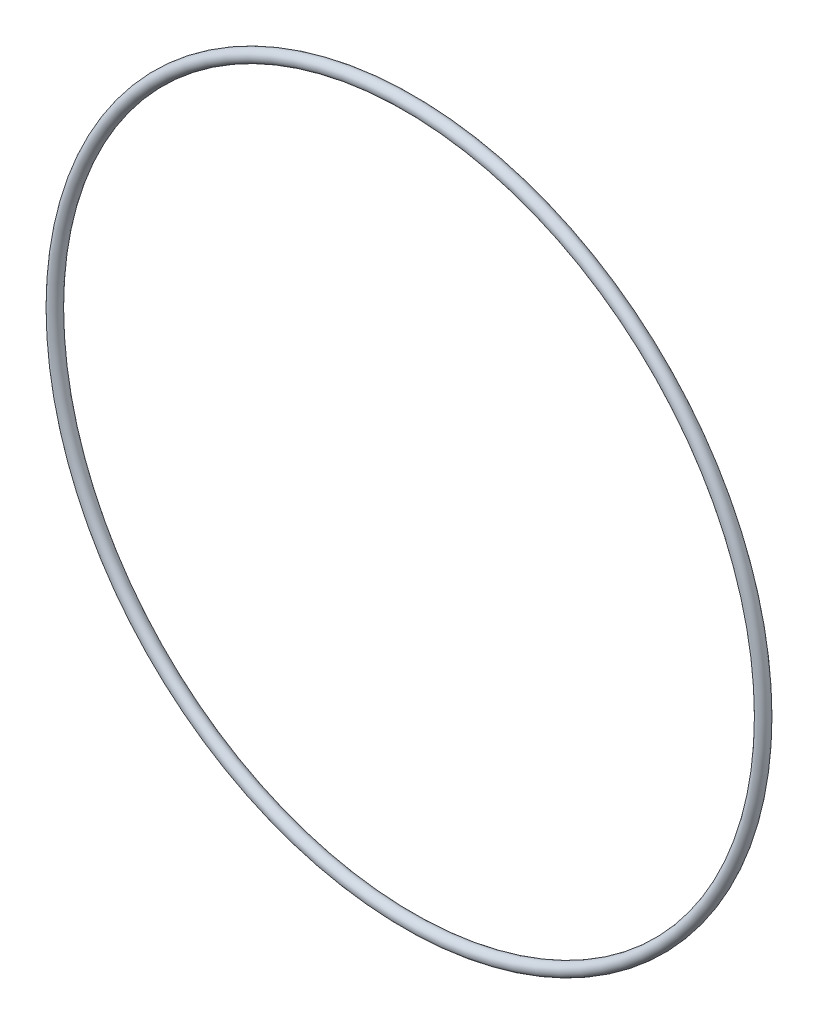
ISO-10303-21;
HEADER;
FILE_DESCRIPTION(('STEP AP214'),'2;1');
FILE_NAME('part.step','',(''),(''),'','','');
FILE_SCHEMA(('AUTOMOTIVE_DESIGN { 1 0 10303 214 1 1 1 1 }'));
ENDSEC;
DATA;
#1=APPLICATION_CONTEXT('core data for automotive mechanical design processes');
#2=APPLICATION_PROTOCOL_DEFINITION('international standard','automotive_design',2000,#1);
#3=PRODUCT_CONTEXT('',#1,'mechanical');
#4=PRODUCT('Part','Part','',(#3));
#5=PRODUCT_RELATED_PRODUCT_CATEGORY('part','',(#4));
#6=PRODUCT_DEFINITION_FORMATION('','',#4);
#7=PRODUCT_DEFINITION_CONTEXT('part definition',#1,'design');
#8=PRODUCT_DEFINITION('design','',#6,#7);
#9=PRODUCT_DEFINITION_SHAPE('','',#8);
#10=(LENGTH_UNIT() NAMED_UNIT(*) SI_UNIT(.MILLI.,.METRE.));
#11=(NAMED_UNIT(*) PLANE_ANGLE_UNIT() SI_UNIT($,.RADIAN.));
#12=(NAMED_UNIT(*) SI_UNIT($,.STERADIAN.) SOLID_ANGLE_UNIT());
#13=UNCERTAINTY_MEASURE_WITH_UNIT(LENGTH_MEASURE(1.E-05),#10,'distance_accuracy_value','');
#14=(GEOMETRIC_REPRESENTATION_CONTEXT(3) GLOBAL_UNCERTAINTY_ASSIGNED_CONTEXT((#13)) GLOBAL_UNIT_ASSIGNED_CONTEXT((#10,
#11,#12)) REPRESENTATION_CONTEXT('',''));
#15=CARTESIAN_POINT('',(0.,0.,0.));
#16=DIRECTION('',(0.,0.,1.));
#17=DIRECTION('',(1.,0.,0.));
#18=AXIS2_PLACEMENT_3D('',#15,#16,#17);
#19=CARTESIAN_POINT('',(0.,0.,0.));
#20=DIRECTION('',(0.,0.,1.));
#21=DIRECTION('',(1.,0.,0.));
#22=AXIS2_PLACEMENT_3D('',#19,#20,#21);
#23=TOROIDAL_SURFACE('',#22,85.5,1.5);
#24=CARTESIAN_POINT('',(87.,0.,0.));
#25=VERTEX_POINT('',#24);
#26=VERTEX_LOOP('',#25);
#27=FACE_BOUND('',#26,.T.);
#28=ADVANCED_FACE('F42',(#27),#23,.T.);
#29=CLOSED_SHELL('',(#28));
#30=MANIFOLD_SOLID_BREP('B2',#29);
#31=ADVANCED_BREP_SHAPE_REPRESENTATION('',(#18,#30),#14);
#32=SHAPE_DEFINITION_REPRESENTATION(#9,#31);
ENDSEC;
END-ISO-10303-21;
